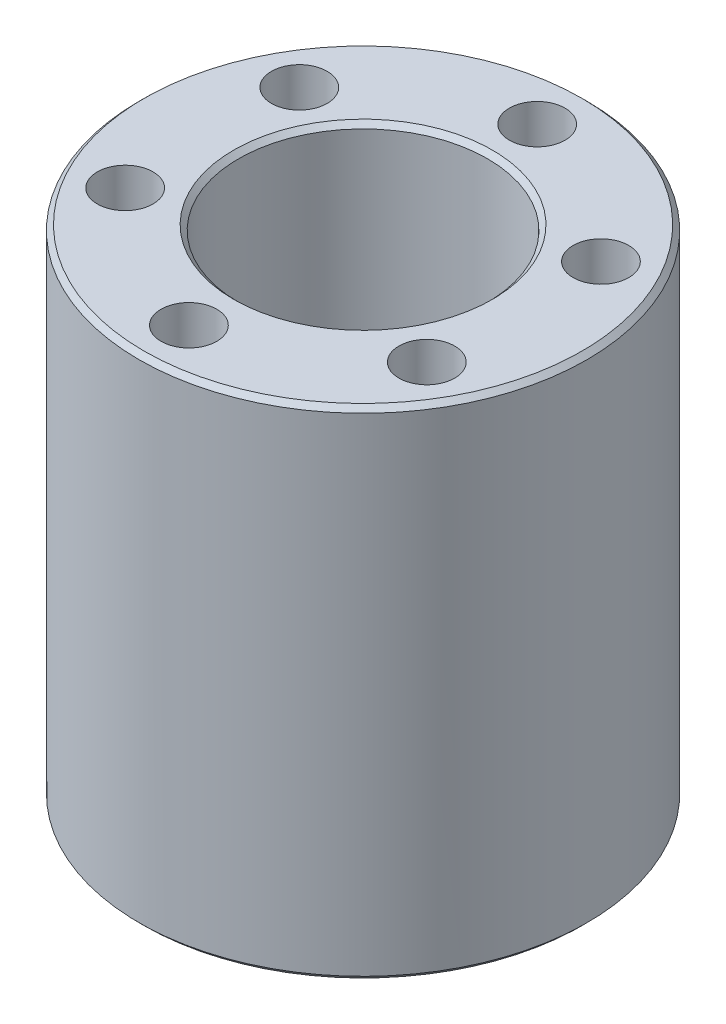
ISO-10303-21;
HEADER;
FILE_DESCRIPTION(('STEP AP214'),'2;1');
FILE_NAME('part.step','',(''),(''),'','','');
FILE_SCHEMA(('AUTOMOTIVE_DESIGN { 1 0 10303 214 1 1 1 1 }'));
ENDSEC;
DATA;
#1=APPLICATION_CONTEXT('core data for automotive mechanical design processes');
#2=APPLICATION_PROTOCOL_DEFINITION('international standard','automotive_design',2000,#1);
#3=PRODUCT_CONTEXT('',#1,'mechanical');
#4=PRODUCT('Part','Part','',(#3));
#5=PRODUCT_RELATED_PRODUCT_CATEGORY('part','',(#4));
#6=PRODUCT_DEFINITION_FORMATION('','',#4);
#7=PRODUCT_DEFINITION_CONTEXT('part definition',#1,'design');
#8=PRODUCT_DEFINITION('design','',#6,#7);
#9=PRODUCT_DEFINITION_SHAPE('','',#8);
#10=(LENGTH_UNIT() NAMED_UNIT(*) SI_UNIT(.MILLI.,.METRE.));
#11=(NAMED_UNIT(*) PLANE_ANGLE_UNIT() SI_UNIT($,.RADIAN.));
#12=(NAMED_UNIT(*) SI_UNIT($,.STERADIAN.) SOLID_ANGLE_UNIT());
#13=UNCERTAINTY_MEASURE_WITH_UNIT(LENGTH_MEASURE(1.E-05),#10,'distance_accuracy_value','');
#14=(GEOMETRIC_REPRESENTATION_CONTEXT(3) GLOBAL_UNCERTAINTY_ASSIGNED_CONTEXT((#13)) GLOBAL_UNIT_ASSIGNED_CONTEXT((#10,
#11,#12)) REPRESENTATION_CONTEXT('',''));
#15=CARTESIAN_POINT('',(0.,0.,0.));
#16=DIRECTION('',(0.,0.,1.));
#17=DIRECTION('',(1.,0.,0.));
#18=AXIS2_PLACEMENT_3D('',#15,#16,#17);
#19=CARTESIAN_POINT('',(0.,0.,0.));
#20=DIRECTION('',(0.,-1.,0.));
#21=DIRECTION('',(0.,0.,-1.));
#22=AXIS2_PLACEMENT_3D('',#19,#20,#21);
#23=CYLINDRICAL_SURFACE('',#22,12.5);
#24=CARTESIAN_POINT('',(0.,-24.5,0.));
#25=DIRECTION('',(0.,-1.,0.));
#26=DIRECTION('',(0.,0.,-1.));
#27=AXIS2_PLACEMENT_3D('',#24,#25,#26);
#28=CIRCLE('',#27,12.5);
#29=CARTESIAN_POINT('',(0.,-24.5,-12.5));
#30=VERTEX_POINT('',#29);
#31=EDGE_CURVE('E171',#30,#30,#28,.T.);
#32=ORIENTED_EDGE('',*,*,#31,.T.);
#33=EDGE_LOOP('',(#32));
#34=FACE_BOUND('',#33,.T.);
#35=CARTESIAN_POINT('',(0.,24.5,0.));
#36=DIRECTION('',(0.,1.,0.));
#37=DIRECTION('',(0.,0.,1.));
#38=AXIS2_PLACEMENT_3D('',#35,#36,#37);
#39=CIRCLE('',#38,12.5);
#40=CARTESIAN_POINT('',(0.,24.5,12.5));
#41=VERTEX_POINT('',#40);
#42=EDGE_CURVE('E168',#41,#41,#39,.T.);
#43=ORIENTED_EDGE('',*,*,#42,.T.);
#44=EDGE_LOOP('',(#43));
#45=FACE_BOUND('',#44,.T.);
#46=ADVANCED_FACE('F41',(#34,#45),#23,.F.);
#47=CARTESIAN_POINT('',(12.5,25.,0.));
#48=DIRECTION('',(0.,1.,0.));
#49=DIRECTION('',(0.,0.,1.));
#50=AXIS2_PLACEMENT_3D('',#47,#48,#49);
#51=PLANE('',#50);
#52=CARTESIAN_POINT('',(0.,25.,0.));
#53=DIRECTION('',(0.,1.,0.));
#54=DIRECTION('',(0.,0.,1.));
#55=AXIS2_PLACEMENT_3D('',#52,#53,#54);
#56=CIRCLE('',#55,13.);
#57=CARTESIAN_POINT('',(0.,25.,13.));
#58=VERTEX_POINT('',#57);
#59=EDGE_CURVE('E183',#58,#58,#56,.F.);
#60=ORIENTED_EDGE('',*,*,#59,.T.);
#61=EDGE_LOOP('',(#60));
#62=FACE_BOUND('',#61,.T.);
#63=CARTESIAN_POINT('',(0.,25.,0.));
#64=DIRECTION('',(0.,1.,0.));
#65=DIRECTION('',(0.,0.,1.));
#66=AXIS2_PLACEMENT_3D('',#63,#64,#65);
#67=CIRCLE('',#66,22.);
#68=CARTESIAN_POINT('',(0.,25.,22.));
#69=VERTEX_POINT('',#68);
#70=EDGE_CURVE('E180',#69,#69,#67,.T.);
#71=ORIENTED_EDGE('',*,*,#70,.T.);
#72=EDGE_LOOP('',(#71));
#73=FACE_BOUND('',#72,.T.);
#74=CARTESIAN_POINT('',(0.,25.,17.5));
#75=DIRECTION('',(0.,1.,0.));
#76=DIRECTION('',(0.,0.,1.));
#77=AXIS2_PLACEMENT_3D('',#74,#75,#76);
#78=CIRCLE('',#77,2.79999999999999);
#79=CARTESIAN_POINT('',(0.,25.,20.3));
#80=VERTEX_POINT('',#79);
#81=EDGE_CURVE('E132',#80,#80,#78,.T.);
#82=ORIENTED_EDGE('',*,*,#81,.F.);
#83=EDGE_LOOP('',(#82));
#84=FACE_BOUND('',#83,.T.);
#85=CARTESIAN_POINT('',(-15.1554445662277,25.,8.74999999999997));
#86=DIRECTION('',(0.,1.,0.));
#87=DIRECTION('',(0.,0.,1.));
#88=AXIS2_PLACEMENT_3D('',#85,#86,#87);
#89=CIRCLE('',#88,2.79999999999999);
#90=CARTESIAN_POINT('',(-15.1554445662277,25.,11.55));
#91=VERTEX_POINT('',#90);
#92=EDGE_CURVE('E138',#91,#91,#89,.T.);
#93=ORIENTED_EDGE('',*,*,#92,.F.);
#94=EDGE_LOOP('',(#93));
#95=FACE_BOUND('',#94,.T.);
#96=CARTESIAN_POINT('',(-15.1554445662276,25.,-8.75000000000007));
#97=DIRECTION('',(0.,1.,0.));
#98=DIRECTION('',(0.,0.,1.));
#99=AXIS2_PLACEMENT_3D('',#96,#97,#98);
#100=CIRCLE('',#99,2.79999999999999);
#101=CARTESIAN_POINT('',(-15.1554445662276,25.,-5.95000000000008));
#102=VERTEX_POINT('',#101);
#103=EDGE_CURVE('E144',#102,#102,#100,.T.);
#104=ORIENTED_EDGE('',*,*,#103,.F.);
#105=EDGE_LOOP('',(#104));
#106=FACE_BOUND('',#105,.T.);
#107=CARTESIAN_POINT('',(1.2220184685951E-13,25.,-17.5));
#108=DIRECTION('',(0.,1.,0.));
#109=DIRECTION('',(0.,0.,1.));
#110=AXIS2_PLACEMENT_3D('',#107,#108,#109);
#111=CIRCLE('',#110,2.79999999999999);
#112=CARTESIAN_POINT('',(1.2220184685951E-13,25.,-14.7));
#113=VERTEX_POINT('',#112);
#114=EDGE_CURVE('E150',#113,#113,#111,.T.);
#115=ORIENTED_EDGE('',*,*,#114,.F.);
#116=EDGE_LOOP('',(#115));
#117=FACE_BOUND('',#116,.T.);
#118=CARTESIAN_POINT('',(15.1554445662278,25.,-8.74999999999986));
#119=DIRECTION('',(0.,1.,0.));
#120=DIRECTION('',(0.,0.,1.));
#121=AXIS2_PLACEMENT_3D('',#118,#119,#120);
#122=CIRCLE('',#121,2.79999999999999);
#123=CARTESIAN_POINT('',(15.1554445662278,25.,-5.94999999999987));
#124=VERTEX_POINT('',#123);
#125=EDGE_CURVE('E156',#124,#124,#122,.T.);
#126=ORIENTED_EDGE('',*,*,#125,.F.);
#127=EDGE_LOOP('',(#126));
#128=FACE_BOUND('',#127,.T.);
#129=CARTESIAN_POINT('',(15.1554445662276,25.,8.75000000000018));
#130=DIRECTION('',(0.,1.,0.));
#131=DIRECTION('',(0.,0.,1.));
#132=AXIS2_PLACEMENT_3D('',#129,#130,#131);
#133=CIRCLE('',#132,2.79999999999999);
#134=CARTESIAN_POINT('',(15.1554445662276,25.,11.5500000000002));
#135=VERTEX_POINT('',#134);
#136=EDGE_CURVE('E162',#135,#135,#133,.T.);
#137=ORIENTED_EDGE('',*,*,#136,.F.);
#138=EDGE_LOOP('',(#137));
#139=FACE_BOUND('',#138,.T.);
#140=ADVANCED_FACE('F200',(#62,#73,#84,#95,#106,#117,#128,#139),#51,.T.);
#141=CARTESIAN_POINT('',(0.,0.,0.));
#142=DIRECTION('',(0.,-1.,0.));
#143=DIRECTION('',(0.,0.,-1.));
#144=AXIS2_PLACEMENT_3D('',#141,#142,#143);
#145=CYLINDRICAL_SURFACE('',#144,22.5);
#146=CARTESIAN_POINT('',(0.,-24.5,0.));
#147=DIRECTION('',(0.,-1.,0.));
#148=DIRECTION('',(0.,0.,-1.));
#149=AXIS2_PLACEMENT_3D('',#146,#147,#148);
#150=CIRCLE('',#149,22.5);
#151=CARTESIAN_POINT('',(0.,-24.5,-22.5));
#152=VERTEX_POINT('',#151);
#153=EDGE_CURVE('E11',#152,#152,#150,.F.);
#154=ORIENTED_EDGE('',*,*,#153,.T.);
#155=EDGE_LOOP('',(#154));
#156=FACE_BOUND('',#155,.T.);
#157=CARTESIAN_POINT('',(0.,24.5,0.));
#158=DIRECTION('',(0.,1.,0.));
#159=DIRECTION('',(0.,0.,1.));
#160=AXIS2_PLACEMENT_3D('',#157,#158,#159);
#161=CIRCLE('',#160,22.5);
#162=CARTESIAN_POINT('',(0.,24.5,22.5));
#163=VERTEX_POINT('',#162);
#164=EDGE_CURVE('E50',#163,#163,#161,.F.);
#165=ORIENTED_EDGE('',*,*,#164,.T.);
#166=EDGE_LOOP('',(#165));
#167=FACE_BOUND('',#166,.T.);
#168=ADVANCED_FACE('F188',(#156,#167),#145,.T.);
#169=CARTESIAN_POINT('',(15.1554445662276,17.,8.75000000000018));
#170=DIRECTION('',(0.,1.,0.));
#171=DIRECTION('',(0.,0.,1.));
#172=AXIS2_PLACEMENT_3D('',#169,#170,#171);
#173=CONICAL_SURFACE('',#172,2.79999999999999,1.02974425867665);
#174=CARTESIAN_POINT('',(15.1554445662276,15.3175902667228,8.75000000000018));
#175=VERTEX_POINT('',#174);
#176=VERTEX_LOOP('',#175);
#177=FACE_BOUND('',#176,.T.);
#178=CARTESIAN_POINT('',(15.1554445662276,17.,8.75000000000018));
#179=DIRECTION('',(0.,1.,0.));
#180=DIRECTION('',(0.,0.,1.));
#181=AXIS2_PLACEMENT_3D('',#178,#179,#180);
#182=CIRCLE('',#181,2.79999999999999);
#183=CARTESIAN_POINT('',(15.1554445662276,17.,11.5500000000002));
#184=VERTEX_POINT('',#183);
#185=EDGE_CURVE('E165',#184,#184,#182,.T.);
#186=ORIENTED_EDGE('',*,*,#185,.T.);
#187=EDGE_LOOP('',(#186));
#188=FACE_BOUND('',#187,.T.);
#189=ADVANCED_FACE('F251',(#177,#188),#173,.F.);
#190=CARTESIAN_POINT('',(15.1554445662276,25.,8.75000000000018));
#191=DIRECTION('',(0.,1.,0.));
#192=DIRECTION('',(0.,0.,1.));
#193=AXIS2_PLACEMENT_3D('',#190,#191,#192);
#194=CYLINDRICAL_SURFACE('',#193,2.79999999999999);
#195=ORIENTED_EDGE('',*,*,#185,.F.);
#196=EDGE_LOOP('',(#195));
#197=FACE_BOUND('',#196,.T.);
#198=ORIENTED_EDGE('',*,*,#136,.T.);
#199=EDGE_LOOP('',(#198));
#200=FACE_BOUND('',#199,.T.);
#201=ADVANCED_FACE('F248',(#197,#200),#194,.F.);
#202=CARTESIAN_POINT('',(15.1554445662278,17.,-8.74999999999986));
#203=DIRECTION('',(0.,1.,0.));
#204=DIRECTION('',(0.,0.,1.));
#205=AXIS2_PLACEMENT_3D('',#202,#203,#204);
#206=CONICAL_SURFACE('',#205,2.79999999999999,1.02974425867665);
#207=CARTESIAN_POINT('',(15.1554445662278,15.3175902667228,-8.74999999999986));
#208=VERTEX_POINT('',#207);
#209=VERTEX_LOOP('',#208);
#210=FACE_BOUND('',#209,.T.);
#211=CARTESIAN_POINT('',(15.1554445662278,17.,-8.74999999999986));
#212=DIRECTION('',(0.,1.,0.));
#213=DIRECTION('',(0.,0.,1.));
#214=AXIS2_PLACEMENT_3D('',#211,#212,#213);
#215=CIRCLE('',#214,2.79999999999999);
#216=CARTESIAN_POINT('',(15.1554445662278,17.,-5.94999999999987));
#217=VERTEX_POINT('',#216);
#218=EDGE_CURVE('E159',#217,#217,#215,.T.);
#219=ORIENTED_EDGE('',*,*,#218,.T.);
#220=EDGE_LOOP('',(#219));
#221=FACE_BOUND('',#220,.T.);
#222=ADVANCED_FACE('F250',(#210,#221),#206,.F.);
#223=CARTESIAN_POINT('',(15.1554445662278,25.,-8.74999999999986));
#224=DIRECTION('',(0.,1.,0.));
#225=DIRECTION('',(0.,0.,1.));
#226=AXIS2_PLACEMENT_3D('',#223,#224,#225);
#227=CYLINDRICAL_SURFACE('',#226,2.79999999999999);
#228=ORIENTED_EDGE('',*,*,#218,.F.);
#229=EDGE_LOOP('',(#228));
#230=FACE_BOUND('',#229,.T.);
#231=ORIENTED_EDGE('',*,*,#125,.T.);
#232=EDGE_LOOP('',(#231));
#233=FACE_BOUND('',#232,.T.);
#234=ADVANCED_FACE('F258',(#230,#233),#227,.F.);
#235=CARTESIAN_POINT('',(1.2220184685951E-13,17.,-17.5));
#236=DIRECTION('',(0.,1.,0.));
#237=DIRECTION('',(0.,0.,1.));
#238=AXIS2_PLACEMENT_3D('',#235,#236,#237);
#239=CONICAL_SURFACE('',#238,2.79999999999999,1.02974425867665);
#240=CARTESIAN_POINT('',(1.19830340441931E-13,15.3175902667228,-17.5));
#241=VERTEX_POINT('',#240);
#242=VERTEX_LOOP('',#241);
#243=FACE_BOUND('',#242,.T.);
#244=CARTESIAN_POINT('',(1.2220184685951E-13,17.,-17.5));
#245=DIRECTION('',(0.,1.,0.));
#246=DIRECTION('',(0.,0.,1.));
#247=AXIS2_PLACEMENT_3D('',#244,#245,#246);
#248=CIRCLE('',#247,2.79999999999999);
#249=CARTESIAN_POINT('',(1.2220184685951E-13,17.,-14.7));
#250=VERTEX_POINT('',#249);
#251=EDGE_CURVE('E153',#250,#250,#248,.T.);
#252=ORIENTED_EDGE('',*,*,#251,.T.);
#253=EDGE_LOOP('',(#252));
#254=FACE_BOUND('',#253,.T.);
#255=ADVANCED_FACE('F333',(#243,#254),#239,.F.);
#256=CARTESIAN_POINT('',(1.2220184685951E-13,25.,-17.5));
#257=DIRECTION('',(0.,1.,0.));
#258=DIRECTION('',(0.,0.,1.));
#259=AXIS2_PLACEMENT_3D('',#256,#257,#258);
#260=CYLINDRICAL_SURFACE('',#259,2.79999999999999);
#261=ORIENTED_EDGE('',*,*,#251,.F.);
#262=EDGE_LOOP('',(#261));
#263=FACE_BOUND('',#262,.T.);
#264=ORIENTED_EDGE('',*,*,#114,.T.);
#265=EDGE_LOOP('',(#264));
#266=FACE_BOUND('',#265,.T.);
#267=ADVANCED_FACE('F329',(#263,#266),#260,.F.);
#268=CARTESIAN_POINT('',(-15.1554445662276,17.,-8.75000000000007));
#269=DIRECTION('',(0.,1.,0.));
#270=DIRECTION('',(0.,0.,1.));
#271=AXIS2_PLACEMENT_3D('',#268,#269,#270);
#272=CONICAL_SURFACE('',#271,2.79999999999999,1.02974425867665);
#273=CARTESIAN_POINT('',(-15.1554445662276,15.3175902667228,-8.75000000000007));
#274=VERTEX_POINT('',#273);
#275=VERTEX_LOOP('',#274);
#276=FACE_BOUND('',#275,.T.);
#277=CARTESIAN_POINT('',(-15.1554445662276,17.,-8.75000000000007));
#278=DIRECTION('',(0.,1.,0.));
#279=DIRECTION('',(0.,0.,1.));
#280=AXIS2_PLACEMENT_3D('',#277,#278,#279);
#281=CIRCLE('',#280,2.79999999999999);
#282=CARTESIAN_POINT('',(-15.1554445662276,17.,-5.95000000000008));
#283=VERTEX_POINT('',#282);
#284=EDGE_CURVE('E147',#283,#283,#281,.T.);
#285=ORIENTED_EDGE('',*,*,#284,.T.);
#286=EDGE_LOOP('',(#285));
#287=FACE_BOUND('',#286,.T.);
#288=ADVANCED_FACE('F325',(#276,#287),#272,.F.);
#289=CARTESIAN_POINT('',(-15.1554445662276,25.,-8.75000000000007));
#290=DIRECTION('',(0.,1.,0.));
#291=DIRECTION('',(0.,0.,1.));
#292=AXIS2_PLACEMENT_3D('',#289,#290,#291);
#293=CYLINDRICAL_SURFACE('',#292,2.79999999999999);
#294=ORIENTED_EDGE('',*,*,#284,.F.);
#295=EDGE_LOOP('',(#294));
#296=FACE_BOUND('',#295,.T.);
#297=ORIENTED_EDGE('',*,*,#103,.T.);
#298=EDGE_LOOP('',(#297));
#299=FACE_BOUND('',#298,.T.);
#300=ADVANCED_FACE('F321',(#296,#299),#293,.F.);
#301=CARTESIAN_POINT('',(-15.1554445662277,17.,8.74999999999997));
#302=DIRECTION('',(0.,1.,0.));
#303=DIRECTION('',(0.,0.,1.));
#304=AXIS2_PLACEMENT_3D('',#301,#302,#303);
#305=CONICAL_SURFACE('',#304,2.79999999999999,1.02974425867665);
#306=CARTESIAN_POINT('',(-15.1554445662277,15.3175902667228,8.74999999999997));
#307=VERTEX_POINT('',#306);
#308=VERTEX_LOOP('',#307);
#309=FACE_BOUND('',#308,.T.);
#310=CARTESIAN_POINT('',(-15.1554445662277,17.,8.74999999999997));
#311=DIRECTION('',(0.,1.,0.));
#312=DIRECTION('',(0.,0.,1.));
#313=AXIS2_PLACEMENT_3D('',#310,#311,#312);
#314=CIRCLE('',#313,2.79999999999999);
#315=CARTESIAN_POINT('',(-15.1554445662277,17.,11.55));
#316=VERTEX_POINT('',#315);
#317=EDGE_CURVE('E141',#316,#316,#314,.T.);
#318=ORIENTED_EDGE('',*,*,#317,.T.);
#319=EDGE_LOOP('',(#318));
#320=FACE_BOUND('',#319,.T.);
#321=ADVANCED_FACE('F317',(#309,#320),#305,.F.);
#322=CARTESIAN_POINT('',(-15.1554445662277,25.,8.74999999999997));
#323=DIRECTION('',(0.,1.,0.));
#324=DIRECTION('',(0.,0.,1.));
#325=AXIS2_PLACEMENT_3D('',#322,#323,#324);
#326=CYLINDRICAL_SURFACE('',#325,2.79999999999999);
#327=ORIENTED_EDGE('',*,*,#317,.F.);
#328=EDGE_LOOP('',(#327));
#329=FACE_BOUND('',#328,.T.);
#330=ORIENTED_EDGE('',*,*,#92,.T.);
#331=EDGE_LOOP('',(#330));
#332=FACE_BOUND('',#331,.T.);
#333=ADVANCED_FACE('F313',(#329,#332),#326,.F.);
#334=CARTESIAN_POINT('',(0.,17.,17.5));
#335=DIRECTION('',(0.,1.,0.));
#336=DIRECTION('',(0.,0.,1.));
#337=AXIS2_PLACEMENT_3D('',#334,#335,#336);
#338=CONICAL_SURFACE('',#337,2.79999999999999,1.02974425867665);
#339=CARTESIAN_POINT('',(0.,15.3175902667228,17.5));
#340=VERTEX_POINT('',#339);
#341=VERTEX_LOOP('',#340);
#342=FACE_BOUND('',#341,.T.);
#343=CARTESIAN_POINT('',(0.,17.,17.5));
#344=DIRECTION('',(0.,1.,0.));
#345=DIRECTION('',(0.,0.,1.));
#346=AXIS2_PLACEMENT_3D('',#343,#344,#345);
#347=CIRCLE('',#346,2.79999999999999);
#348=CARTESIAN_POINT('',(0.,17.,20.3));
#349=VERTEX_POINT('',#348);
#350=EDGE_CURVE('E135',#349,#349,#347,.T.);
#351=ORIENTED_EDGE('',*,*,#350,.T.);
#352=EDGE_LOOP('',(#351));
#353=FACE_BOUND('',#352,.T.);
#354=ADVANCED_FACE('F309',(#342,#353),#338,.F.);
#355=CARTESIAN_POINT('',(0.,25.,17.5));
#356=DIRECTION('',(0.,1.,0.));
#357=DIRECTION('',(0.,0.,1.));
#358=AXIS2_PLACEMENT_3D('',#355,#356,#357);
#359=CYLINDRICAL_SURFACE('',#358,2.79999999999999);
#360=ORIENTED_EDGE('',*,*,#350,.F.);
#361=EDGE_LOOP('',(#360));
#362=FACE_BOUND('',#361,.T.);
#363=ORIENTED_EDGE('',*,*,#81,.T.);
#364=EDGE_LOOP('',(#363));
#365=FACE_BOUND('',#364,.T.);
#366=ADVANCED_FACE('F275',(#362,#365),#359,.F.);
#367=CARTESIAN_POINT('',(12.5,-25.,0.));
#368=DIRECTION('',(0.,-1.,0.));
#369=DIRECTION('',(0.,0.,1.));
#370=AXIS2_PLACEMENT_3D('',#367,#368,#369);
#371=PLANE('',#370);
#372=CARTESIAN_POINT('',(0.,-25.,0.));
#373=DIRECTION('',(0.,-1.,0.));
#374=DIRECTION('',(0.,0.,-1.));
#375=AXIS2_PLACEMENT_3D('',#372,#373,#374);
#376=CIRCLE('',#375,13.);
#377=CARTESIAN_POINT('',(0.,-25.,-13.));
#378=VERTEX_POINT('',#377);
#379=EDGE_CURVE('E177',#378,#378,#376,.F.);
#380=ORIENTED_EDGE('',*,*,#379,.T.);
#381=EDGE_LOOP('',(#380));
#382=FACE_BOUND('',#381,.T.);
#383=CARTESIAN_POINT('',(0.,-25.,0.));
#384=DIRECTION('',(0.,-1.,0.));
#385=DIRECTION('',(0.,0.,-1.));
#386=AXIS2_PLACEMENT_3D('',#383,#384,#385);
#387=CIRCLE('',#386,22.);
#388=CARTESIAN_POINT('',(0.,-25.,-22.));
#389=VERTEX_POINT('',#388);
#390=EDGE_CURVE('E174',#389,#389,#387,.T.);
#391=ORIENTED_EDGE('',*,*,#390,.T.);
#392=EDGE_LOOP('',(#391));
#393=FACE_BOUND('',#392,.T.);
#394=CARTESIAN_POINT('',(0.,-25.,17.5));
#395=DIRECTION('',(0.,-1.,0.));
#396=DIRECTION('',(0.,0.,-1.));
#397=AXIS2_PLACEMENT_3D('',#394,#395,#396);
#398=CIRCLE('',#397,2.79999999999999);
#399=CARTESIAN_POINT('',(0.,-25.,14.7));
#400=VERTEX_POINT('',#399);
#401=EDGE_CURVE('E98',#400,#400,#398,.T.);
#402=ORIENTED_EDGE('',*,*,#401,.F.);
#403=EDGE_LOOP('',(#402));
#404=FACE_BOUND('',#403,.T.);
#405=CARTESIAN_POINT('',(-15.1554445662277,-25.,8.74999999999997));
#406=DIRECTION('',(0.,-1.,0.));
#407=DIRECTION('',(0.,0.,-1.));
#408=AXIS2_PLACEMENT_3D('',#405,#406,#407);
#409=CIRCLE('',#408,2.79999999999999);
#410=CARTESIAN_POINT('',(-15.1554445662277,-25.,5.94999999999998));
#411=VERTEX_POINT('',#410);
#412=EDGE_CURVE('E97',#411,#411,#409,.T.);
#413=ORIENTED_EDGE('',*,*,#412,.F.);
#414=EDGE_LOOP('',(#413));
#415=FACE_BOUND('',#414,.T.);
#416=CARTESIAN_POINT('',(-15.1554445662276,-25.,-8.75000000000007));
#417=DIRECTION('',(0.,-1.,0.));
#418=DIRECTION('',(0.,0.,-1.));
#419=AXIS2_PLACEMENT_3D('',#416,#417,#418);
#420=CIRCLE('',#419,2.79999999999999);
#421=CARTESIAN_POINT('',(-15.1554445662276,-25.,-11.5500000000001));
#422=VERTEX_POINT('',#421);
#423=EDGE_CURVE('E108',#422,#422,#420,.T.);
#424=ORIENTED_EDGE('',*,*,#423,.F.);
#425=EDGE_LOOP('',(#424));
#426=FACE_BOUND('',#425,.T.);
#427=CARTESIAN_POINT('',(1.2220184685951E-13,-25.,-17.5));
#428=DIRECTION('',(0.,-1.,0.));
#429=DIRECTION('',(0.,0.,-1.));
#430=AXIS2_PLACEMENT_3D('',#427,#428,#429);
#431=CIRCLE('',#430,2.79999999999999);
#432=CARTESIAN_POINT('',(1.2220184685951E-13,-25.,-20.3));
#433=VERTEX_POINT('',#432);
#434=EDGE_CURVE('E114',#433,#433,#431,.T.);
#435=ORIENTED_EDGE('',*,*,#434,.F.);
#436=EDGE_LOOP('',(#435));
#437=FACE_BOUND('',#436,.T.);
#438=CARTESIAN_POINT('',(15.1554445662278,-25.,-8.74999999999986));
#439=DIRECTION('',(0.,-1.,0.));
#440=DIRECTION('',(0.,0.,-1.));
#441=AXIS2_PLACEMENT_3D('',#438,#439,#440);
#442=CIRCLE('',#441,2.79999999999999);
#443=CARTESIAN_POINT('',(15.1554445662278,-25.,-11.5499999999998));
#444=VERTEX_POINT('',#443);
#445=EDGE_CURVE('E120',#444,#444,#442,.T.);
#446=ORIENTED_EDGE('',*,*,#445,.F.);
#447=EDGE_LOOP('',(#446));
#448=FACE_BOUND('',#447,.T.);
#449=CARTESIAN_POINT('',(15.1554445662276,-25.,8.75000000000018));
#450=DIRECTION('',(0.,-1.,0.));
#451=DIRECTION('',(0.,0.,-1.));
#452=AXIS2_PLACEMENT_3D('',#449,#450,#451);
#453=CIRCLE('',#452,2.79999999999999);
#454=CARTESIAN_POINT('',(15.1554445662276,-25.,5.95000000000019));
#455=VERTEX_POINT('',#454);
#456=EDGE_CURVE('E126',#455,#455,#453,.T.);
#457=ORIENTED_EDGE('',*,*,#456,.F.);
#458=EDGE_LOOP('',(#457));
#459=FACE_BOUND('',#458,.T.);
#460=ADVANCED_FACE('F272',(#382,#393,#404,#415,#426,#437,#448,#459),#371,.T.);
#461=CARTESIAN_POINT('',(15.1554445662276,-17.,8.75000000000018));
#462=DIRECTION('',(0.,-1.,0.));
#463=DIRECTION('',(0.,0.,-1.));
#464=AXIS2_PLACEMENT_3D('',#461,#462,#463);
#465=CONICAL_SURFACE('',#464,2.79999999999999,1.02974425867665);
#466=CARTESIAN_POINT('',(15.1554445662276,-15.3175902667228,8.75000000000018));
#467=VERTEX_POINT('',#466);
#468=VERTEX_LOOP('',#467);
#469=FACE_BOUND('',#468,.T.);
#470=CARTESIAN_POINT('',(15.1554445662276,-17.,8.75000000000018));
#471=DIRECTION('',(0.,-1.,0.));
#472=DIRECTION('',(0.,0.,-1.));
#473=AXIS2_PLACEMENT_3D('',#470,#471,#472);
#474=CIRCLE('',#473,2.79999999999999);
#475=CARTESIAN_POINT('',(15.1554445662276,-17.,5.95000000000019));
#476=VERTEX_POINT('',#475);
#477=EDGE_CURVE('E129',#476,#476,#474,.T.);
#478=ORIENTED_EDGE('',*,*,#477,.T.);
#479=EDGE_LOOP('',(#478));
#480=FACE_BOUND('',#479,.T.);
#481=ADVANCED_FACE('F274',(#469,#480),#465,.F.);
#482=CARTESIAN_POINT('',(15.1554445662276,-25.,8.75000000000018));
#483=DIRECTION('',(0.,-1.,0.));
#484=DIRECTION('',(0.,0.,-1.));
#485=AXIS2_PLACEMENT_3D('',#482,#483,#484);
#486=CYLINDRICAL_SURFACE('',#485,2.79999999999999);
#487=ORIENTED_EDGE('',*,*,#477,.F.);
#488=EDGE_LOOP('',(#487));
#489=FACE_BOUND('',#488,.T.);
#490=ORIENTED_EDGE('',*,*,#456,.T.);
#491=EDGE_LOOP('',(#490));
#492=FACE_BOUND('',#491,.T.);
#493=ADVANCED_FACE('F290',(#489,#492),#486,.F.);
#494=CARTESIAN_POINT('',(15.1554445662278,-17.,-8.74999999999986));
#495=DIRECTION('',(0.,-1.,0.));
#496=DIRECTION('',(0.,0.,-1.));
#497=AXIS2_PLACEMENT_3D('',#494,#495,#496);
#498=CONICAL_SURFACE('',#497,2.79999999999999,1.02974425867665);
#499=CARTESIAN_POINT('',(15.1554445662278,-15.3175902667228,-8.74999999999986));
#500=VERTEX_POINT('',#499);
#501=VERTEX_LOOP('',#500);
#502=FACE_BOUND('',#501,.T.);
#503=CARTESIAN_POINT('',(15.1554445662278,-17.,-8.74999999999986));
#504=DIRECTION('',(0.,-1.,0.));
#505=DIRECTION('',(0.,0.,-1.));
#506=AXIS2_PLACEMENT_3D('',#503,#504,#505);
#507=CIRCLE('',#506,2.79999999999999);
#508=CARTESIAN_POINT('',(15.1554445662278,-17.,-11.5499999999998));
#509=VERTEX_POINT('',#508);
#510=EDGE_CURVE('E123',#509,#509,#507,.T.);
#511=ORIENTED_EDGE('',*,*,#510,.T.);
#512=EDGE_LOOP('',(#511));
#513=FACE_BOUND('',#512,.T.);
#514=ADVANCED_FACE('F292',(#502,#513),#498,.F.);
#515=CARTESIAN_POINT('',(15.1554445662278,-25.,-8.74999999999986));
#516=DIRECTION('',(0.,-1.,0.));
#517=DIRECTION('',(0.,0.,-1.));
#518=AXIS2_PLACEMENT_3D('',#515,#516,#517);
#519=CYLINDRICAL_SURFACE('',#518,2.79999999999999);
#520=ORIENTED_EDGE('',*,*,#510,.F.);
#521=EDGE_LOOP('',(#520));
#522=FACE_BOUND('',#521,.T.);
#523=ORIENTED_EDGE('',*,*,#445,.T.);
#524=EDGE_LOOP('',(#523));
#525=FACE_BOUND('',#524,.T.);
#526=ADVANCED_FACE('F299',(#522,#525),#519,.F.);
#527=CARTESIAN_POINT('',(1.2220184685951E-13,-17.,-17.5));
#528=DIRECTION('',(0.,-1.,0.));
#529=DIRECTION('',(0.,0.,-1.));
#530=AXIS2_PLACEMENT_3D('',#527,#528,#529);
#531=CONICAL_SURFACE('',#530,2.79999999999999,1.02974425867665);
#532=CARTESIAN_POINT('',(1.19830340441931E-13,-15.3175902667228,-17.5));
#533=VERTEX_POINT('',#532);
#534=VERTEX_LOOP('',#533);
#535=FACE_BOUND('',#534,.T.);
#536=CARTESIAN_POINT('',(1.2220184685951E-13,-17.,-17.5));
#537=DIRECTION('',(0.,-1.,0.));
#538=DIRECTION('',(0.,0.,-1.));
#539=AXIS2_PLACEMENT_3D('',#536,#537,#538);
#540=CIRCLE('',#539,2.79999999999999);
#541=CARTESIAN_POINT('',(1.2220184685951E-13,-17.,-20.3));
#542=VERTEX_POINT('',#541);
#543=EDGE_CURVE('E117',#542,#542,#540,.T.);
#544=ORIENTED_EDGE('',*,*,#543,.T.);
#545=EDGE_LOOP('',(#544));
#546=FACE_BOUND('',#545,.T.);
#547=ADVANCED_FACE('F415',(#535,#546),#531,.F.);
#548=CARTESIAN_POINT('',(1.2220184685951E-13,-25.,-17.5));
#549=DIRECTION('',(0.,-1.,0.));
#550=DIRECTION('',(0.,0.,-1.));
#551=AXIS2_PLACEMENT_3D('',#548,#549,#550);
#552=CYLINDRICAL_SURFACE('',#551,2.79999999999999);
#553=ORIENTED_EDGE('',*,*,#543,.F.);
#554=EDGE_LOOP('',(#553));
#555=FACE_BOUND('',#554,.T.);
#556=ORIENTED_EDGE('',*,*,#434,.T.);
#557=EDGE_LOOP('',(#556));
#558=FACE_BOUND('',#557,.T.);
#559=ADVANCED_FACE('F424',(#555,#558),#552,.F.);
#560=CARTESIAN_POINT('',(-15.1554445662276,-17.,-8.75000000000007));
#561=DIRECTION('',(0.,-1.,0.));
#562=DIRECTION('',(0.,0.,-1.));
#563=AXIS2_PLACEMENT_3D('',#560,#561,#562);
#564=CONICAL_SURFACE('',#563,2.79999999999999,1.02974425867665);
#565=CARTESIAN_POINT('',(-15.1554445662276,-15.3175902667228,-8.75000000000007));
#566=VERTEX_POINT('',#565);
#567=VERTEX_LOOP('',#566);
#568=FACE_BOUND('',#567,.T.);
#569=CARTESIAN_POINT('',(-15.1554445662276,-17.,-8.75000000000007));
#570=DIRECTION('',(0.,-1.,0.));
#571=DIRECTION('',(0.,0.,-1.));
#572=AXIS2_PLACEMENT_3D('',#569,#570,#571);
#573=CIRCLE('',#572,2.79999999999999);
#574=CARTESIAN_POINT('',(-15.1554445662276,-17.,-11.5500000000001));
#575=VERTEX_POINT('',#574);
#576=EDGE_CURVE('E111',#575,#575,#573,.T.);
#577=ORIENTED_EDGE('',*,*,#576,.T.);
#578=EDGE_LOOP('',(#577));
#579=FACE_BOUND('',#578,.T.);
#580=ADVANCED_FACE('F434',(#568,#579),#564,.F.);
#581=CARTESIAN_POINT('',(-15.1554445662276,-25.,-8.75000000000007));
#582=DIRECTION('',(0.,-1.,0.));
#583=DIRECTION('',(0.,0.,-1.));
#584=AXIS2_PLACEMENT_3D('',#581,#582,#583);
#585=CYLINDRICAL_SURFACE('',#584,2.79999999999999);
#586=ORIENTED_EDGE('',*,*,#576,.F.);
#587=EDGE_LOOP('',(#586));
#588=FACE_BOUND('',#587,.T.);
#589=ORIENTED_EDGE('',*,*,#423,.T.);
#590=EDGE_LOOP('',(#589));
#591=FACE_BOUND('',#590,.T.);
#592=ADVANCED_FACE('F444',(#588,#591),#585,.F.);
#593=CARTESIAN_POINT('',(-15.1554445662277,-17.,8.74999999999997));
#594=DIRECTION('',(0.,-1.,0.));
#595=DIRECTION('',(0.,0.,-1.));
#596=AXIS2_PLACEMENT_3D('',#593,#594,#595);
#597=CONICAL_SURFACE('',#596,2.79999999999999,1.02974425867665);
#598=CARTESIAN_POINT('',(-15.1554445662277,-15.3175902667228,8.74999999999997));
#599=VERTEX_POINT('',#598);
#600=VERTEX_LOOP('',#599);
#601=FACE_BOUND('',#600,.T.);
#602=CARTESIAN_POINT('',(-15.1554445662277,-17.,8.74999999999997));
#603=DIRECTION('',(0.,-1.,0.));
#604=DIRECTION('',(0.,0.,-1.));
#605=AXIS2_PLACEMENT_3D('',#602,#603,#604);
#606=CIRCLE('',#605,2.79999999999999);
#607=CARTESIAN_POINT('',(-15.1554445662277,-17.,5.94999999999998));
#608=VERTEX_POINT('',#607);
#609=EDGE_CURVE('E101',#608,#608,#606,.T.);
#610=ORIENTED_EDGE('',*,*,#609,.T.);
#611=EDGE_LOOP('',(#610));
#612=FACE_BOUND('',#611,.T.);
#613=ADVANCED_FACE('F454',(#601,#612),#597,.F.);
#614=CARTESIAN_POINT('',(-15.1554445662277,-25.,8.74999999999997));
#615=DIRECTION('',(0.,-1.,0.));
#616=DIRECTION('',(0.,0.,-1.));
#617=AXIS2_PLACEMENT_3D('',#614,#615,#616);
#618=CYLINDRICAL_SURFACE('',#617,2.79999999999999);
#619=ORIENTED_EDGE('',*,*,#609,.F.);
#620=EDGE_LOOP('',(#619));
#621=FACE_BOUND('',#620,.T.);
#622=ORIENTED_EDGE('',*,*,#412,.T.);
#623=EDGE_LOOP('',(#622));
#624=FACE_BOUND('',#623,.T.);
#625=ADVANCED_FACE('F91',(#621,#624),#618,.F.);
#626=CARTESIAN_POINT('',(0.,-17.,17.5));
#627=DIRECTION('',(0.,-1.,0.));
#628=DIRECTION('',(0.,0.,-1.));
#629=AXIS2_PLACEMENT_3D('',#626,#627,#628);
#630=CONICAL_SURFACE('',#629,2.79999999999999,1.02974425867665);
#631=CARTESIAN_POINT('',(0.,-15.3175902667228,17.5));
#632=VERTEX_POINT('',#631);
#633=VERTEX_LOOP('',#632);
#634=FACE_BOUND('',#633,.T.);
#635=CARTESIAN_POINT('',(0.,-17.,17.5));
#636=DIRECTION('',(0.,-1.,0.));
#637=DIRECTION('',(0.,0.,-1.));
#638=AXIS2_PLACEMENT_3D('',#635,#636,#637);
#639=CIRCLE('',#638,2.79999999999999);
#640=CARTESIAN_POINT('',(0.,-17.,14.7));
#641=VERTEX_POINT('',#640);
#642=EDGE_CURVE('E95',#641,#641,#639,.T.);
#643=ORIENTED_EDGE('',*,*,#642,.T.);
#644=EDGE_LOOP('',(#643));
#645=FACE_BOUND('',#644,.T.);
#646=ADVANCED_FACE('F87',(#634,#645),#630,.F.);
#647=CARTESIAN_POINT('',(0.,-25.,17.5));
#648=DIRECTION('',(0.,-1.,0.));
#649=DIRECTION('',(0.,0.,-1.));
#650=AXIS2_PLACEMENT_3D('',#647,#648,#649);
#651=CYLINDRICAL_SURFACE('',#650,2.79999999999999);
#652=ORIENTED_EDGE('',*,*,#642,.F.);
#653=EDGE_LOOP('',(#652));
#654=FACE_BOUND('',#653,.T.);
#655=ORIENTED_EDGE('',*,*,#401,.T.);
#656=EDGE_LOOP('',(#655));
#657=FACE_BOUND('',#656,.T.);
#658=ADVANCED_FACE('F90',(#654,#657),#651,.F.);
#659=CARTESIAN_POINT('',(0.,-24.5,0.));
#660=DIRECTION('',(0.,-1.,0.));
#661=DIRECTION('',(0.,0.,-1.));
#662=AXIS2_PLACEMENT_3D('',#659,#660,#661);
#663=CONICAL_SURFACE('',#662,12.5,0.785398163397464);
#664=ORIENTED_EDGE('',*,*,#379,.F.);
#665=EDGE_LOOP('',(#664));
#666=FACE_BOUND('',#665,.T.);
#667=ORIENTED_EDGE('',*,*,#31,.F.);
#668=EDGE_LOOP('',(#667));
#669=FACE_BOUND('',#668,.T.);
#670=ADVANCED_FACE('F213',(#666,#669),#663,.F.);
#671=CARTESIAN_POINT('',(0.,25.,0.));
#672=DIRECTION('',(0.,1.,0.));
#673=DIRECTION('',(0.,0.,1.));
#674=AXIS2_PLACEMENT_3D('',#671,#672,#673);
#675=CONICAL_SURFACE('',#674,13.,0.785398163397445);
#676=ORIENTED_EDGE('',*,*,#42,.F.);
#677=EDGE_LOOP('',(#676));
#678=FACE_BOUND('',#677,.T.);
#679=ORIENTED_EDGE('',*,*,#59,.F.);
#680=EDGE_LOOP('',(#679));
#681=FACE_BOUND('',#680,.T.);
#682=ADVANCED_FACE('F196',(#678,#681),#675,.F.);
#683=CARTESIAN_POINT('',(0.,-25.,0.));
#684=DIRECTION('',(0.,1.,0.));
#685=DIRECTION('',(0.,0.,1.));
#686=AXIS2_PLACEMENT_3D('',#683,#684,#685);
#687=CONICAL_SURFACE('',#686,22.,0.785398163397448);
#688=ORIENTED_EDGE('',*,*,#153,.F.);
#689=EDGE_LOOP('',(#688));
#690=FACE_BOUND('',#689,.T.);
#691=ORIENTED_EDGE('',*,*,#390,.F.);
#692=EDGE_LOOP('',(#691));
#693=FACE_BOUND('',#692,.T.);
#694=ADVANCED_FACE('F191',(#690,#693),#687,.T.);
#695=CARTESIAN_POINT('',(0.,24.5,0.));
#696=DIRECTION('',(0.,-1.,0.));
#697=DIRECTION('',(0.,0.,-1.));
#698=AXIS2_PLACEMENT_3D('',#695,#696,#697);
#699=CONICAL_SURFACE('',#698,22.5,0.785398163397448);
#700=ORIENTED_EDGE('',*,*,#70,.F.);
#701=EDGE_LOOP('',(#700));
#702=FACE_BOUND('',#701,.T.);
#703=ORIENTED_EDGE('',*,*,#164,.F.);
#704=EDGE_LOOP('',(#703));
#705=FACE_BOUND('',#704,.T.);
#706=ADVANCED_FACE('F44',(#702,#705),#699,.T.);
#707=CLOSED_SHELL('',(#46,#140,#168,#189,#201,#222,#234,#255,#267,#288,#300,#321,#333,#354,#366,
#460,#481,#493,#514,#526,#547,#559,#580,#592,#613,#625,#646,#658,#670,#682,#694,#706));
#708=MANIFOLD_SOLID_BREP('B2',#707);
#709=ADVANCED_BREP_SHAPE_REPRESENTATION('',(#18,#708),#14);
#710=SHAPE_DEFINITION_REPRESENTATION(#9,#709);
ENDSEC;
END-ISO-10303-21;
